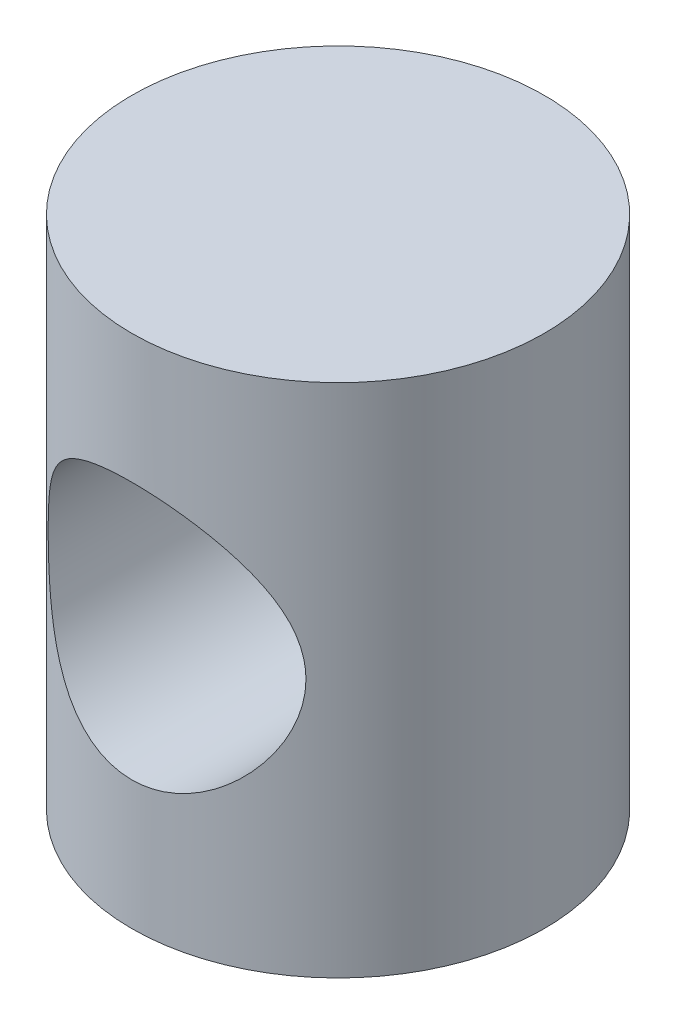
ISO-10303-21;
HEADER;
FILE_DESCRIPTION(('STEP AP214'),'2;1');
FILE_NAME('part.step','',(''),(''),'','','');
FILE_SCHEMA(('AUTOMOTIVE_DESIGN { 1 0 10303 214 1 1 1 1 }'));
ENDSEC;
DATA;
#1=APPLICATION_CONTEXT('core data for automotive mechanical design processes');
#2=APPLICATION_PROTOCOL_DEFINITION('international standard','automotive_design',2000,#1);
#3=PRODUCT_CONTEXT('',#1,'mechanical');
#4=PRODUCT('Part','Part','',(#3));
#5=PRODUCT_RELATED_PRODUCT_CATEGORY('part','',(#4));
#6=PRODUCT_DEFINITION_FORMATION('','',#4);
#7=PRODUCT_DEFINITION_CONTEXT('part definition',#1,'design');
#8=PRODUCT_DEFINITION('design','',#6,#7);
#9=PRODUCT_DEFINITION_SHAPE('','',#8);
#10=(LENGTH_UNIT() NAMED_UNIT(*) SI_UNIT(.MILLI.,.METRE.));
#11=(NAMED_UNIT(*) PLANE_ANGLE_UNIT() SI_UNIT($,.RADIAN.));
#12=(NAMED_UNIT(*) SI_UNIT($,.STERADIAN.) SOLID_ANGLE_UNIT());
#13=UNCERTAINTY_MEASURE_WITH_UNIT(LENGTH_MEASURE(1.E-05),#10,'distance_accuracy_value','');
#14=(GEOMETRIC_REPRESENTATION_CONTEXT(3) GLOBAL_UNCERTAINTY_ASSIGNED_CONTEXT((#13)) GLOBAL_UNIT_ASSIGNED_CONTEXT((#10,
#11,#12)) REPRESENTATION_CONTEXT('',''));
#15=CARTESIAN_POINT('',(0.,0.,0.));
#16=DIRECTION('',(0.,0.,1.));
#17=DIRECTION('',(1.,0.,0.));
#18=AXIS2_PLACEMENT_3D('',#15,#16,#17);
#19=CARTESIAN_POINT('',(0.,10.,0.));
#20=DIRECTION('',(0.,-1.,0.));
#21=DIRECTION('',(0.,0.,-1.));
#22=AXIS2_PLACEMENT_3D('',#19,#20,#21);
#23=CYLINDRICAL_SURFACE('',#22,4.);
#24=CARTESIAN_POINT('',(0.,7.5,-4.));
#25=CARTESIAN_POINT('',(-0.127017476559871,7.49998952385639,-3.99999041333571));
#26=CARTESIAN_POINT('',(-0.254191951791703,7.49025350009832,-3.9938860659399));
#27=CARTESIAN_POINT('',(-0.504637456621344,7.45182887031573,-3.97004375552586));
#28=CARTESIAN_POINT('',(-0.627900575825985,7.42310413973879,-3.95228361873137));
#29=CARTESIAN_POINT('',(-0.866410868269162,7.34837714671246,-3.90691695293563));
#30=CARTESIAN_POINT('',(-0.98169442070943,7.30246039021243,-3.87935918690877));
#31=CARTESIAN_POINT('',(-1.20252080434994,7.19522833250853,-3.81669199838277));
#32=CARTESIAN_POINT('',(-1.30806471304098,7.13391473744688,-3.7815834126609));
#33=CARTESIAN_POINT('',(-1.51594836437078,6.9922268434089,-3.70340304945466));
#34=CARTESIAN_POINT('',(-1.61735911616791,6.91072139729824,-3.65991924217889));
#35=CARTESIAN_POINT('',(-1.80597275567284,6.73356165374148,-3.57062700058922));
#36=CARTESIAN_POINT('',(-1.89315621594404,6.63788834426107,-3.52481549782957));
#37=CARTESIAN_POINT('',(-2.06285746302521,6.41993221070879,-3.42860837235627));
#38=CARTESIAN_POINT('',(-2.14314412018317,6.29580042656906,-3.37843221966147));
#39=CARTESIAN_POINT('',(-2.28147932079995,6.03287036932165,-3.28660396278105));
#40=CARTESIAN_POINT('',(-2.33956541787438,5.89409737483202,-3.2449375200046));
#41=CARTESIAN_POINT('',(-2.41866801180576,5.64237895245428,-3.18619151248815));
#42=CARTESIAN_POINT('',(-2.44539104794679,5.53206636308169,-3.16553811970886));
#43=CARTESIAN_POINT('',(-2.4836368711914,5.30738814861931,-3.1356271466086));
#44=CARTESIAN_POINT('',(-2.49518112485637,5.19302848282679,-3.12635347378456));
#45=CARTESIAN_POINT('',(-2.50237836690497,4.96317396712363,-3.12059771534501));
#46=CARTESIAN_POINT('',(-2.49798968200884,4.84767692942204,-3.12414917427958));
#47=CARTESIAN_POINT('',(-2.47352633347829,4.61937979127337,-3.14354804883411));
#48=CARTESIAN_POINT('',(-2.45343909745149,4.50658192715008,-3.15940531965489));
#49=CARTESIAN_POINT('',(-2.3993620946426,4.28912310325641,-3.20065145822146));
#50=CARTESIAN_POINT('',(-2.36570043522604,4.18433512028263,-3.22581428653571));
#51=CARTESIAN_POINT('',(-2.28580369589507,3.98167760352679,-3.28291134443418));
#52=CARTESIAN_POINT('',(-2.2395641689404,3.88381053215654,-3.31484796808522));
#53=CARTESIAN_POINT('',(-2.12589830407261,3.67833359248984,-3.38909625095658));
#54=CARTESIAN_POINT('',(-2.05612773657747,3.57231894814763,-3.4322315520855));
#55=CARTESIAN_POINT('',(-1.90176111958637,3.3723388730236,-3.52011451554715));
#56=CARTESIAN_POINT('',(-1.81714983251341,3.27838599995486,-3.56486379714022));
#57=CARTESIAN_POINT('',(-1.61904732877734,3.08939899041739,-3.65959667460596));
#58=CARTESIAN_POINT('',(-1.50309447420017,2.9967440572784,-3.70922571443728));
#59=CARTESIAN_POINT('',(-1.25426444468514,2.83228820636899,-3.8005660184067));
#60=CARTESIAN_POINT('',(-1.12139395127005,2.76047909219052,-3.84228039228673));
#61=CARTESIAN_POINT('',(-0.915775751567442,2.67265404336502,-3.89435975869902));
#62=CARTESIAN_POINT('',(-0.848193583187393,2.64716571356961,-3.90966874385268));
#63=CARTESIAN_POINT('',(-0.710492049478446,2.60199234952136,-3.93701839875445));
#64=CARTESIAN_POINT('',(-0.640374175967899,2.58230396342918,-3.94906095588034));
#65=CARTESIAN_POINT('',(-0.498239019538473,2.54906583835761,-3.96949699527849));
#66=CARTESIAN_POINT('',(-0.426223500915276,2.53551059647401,-3.97789374843884));
#67=CARTESIAN_POINT('',(-0.280965673560733,2.51475370668643,-3.99078766491331));
#68=CARTESIAN_POINT('',(-0.207723576570753,2.5075509734527,-3.99528549435853));
#69=CARTESIAN_POINT('',(-0.00911917689680724,2.49689069535646,-4.00193773474167));
#70=CARTESIAN_POINT('',(0.116782016705694,2.49959963687648,-4.000238122366));
#71=CARTESIAN_POINT('',(0.365967766011665,2.52375966446545,-3.98518313408306));
#72=CARTESIAN_POINT('',(0.489252499359948,2.54520947392473,-3.97182855210102));
#73=CARTESIAN_POINT('',(0.725036194002599,2.60447858798278,-3.93547975555369));
#74=CARTESIAN_POINT('',(0.83776842106291,2.64162472076979,-3.91288306371126));
#75=CARTESIAN_POINT('',(1.05527816125331,2.73059237131243,-3.85991402897874));
#76=CARTESIAN_POINT('',(1.16005433861599,2.78241634650143,-3.82954038411642));
#77=CARTESIAN_POINT('',(1.37016761969194,2.90503053750783,-3.75980014020658));
#78=CARTESIAN_POINT('',(1.47449380296905,2.97720717227503,-3.71983526755373));
#79=CARTESIAN_POINT('',(1.67028541330073,3.13558769646929,-3.63613942885727));
#80=CARTESIAN_POINT('',(1.76173634038025,3.22180716888569,-3.59240430473134));
#81=CARTESIAN_POINT('',(1.94294835276253,3.42027008984565,-3.49811738486729));
#82=CARTESIAN_POINT('',(2.03053702733637,3.53447441549752,-3.44749766579192));
#83=CARTESIAN_POINT('',(2.18560704916439,3.77775156698257,-3.35133525746893));
#84=CARTESIAN_POINT('',(2.25310231693768,3.90681401289131,-3.30578906708369));
#85=CARTESIAN_POINT('',(2.35369543821018,4.14938429659957,-3.23467060578839));
#86=CARTESIAN_POINT('',(2.39103791720685,4.26048150138871,-3.20691272363805));
#87=CARTESIAN_POINT('',(2.45000216420747,4.48878629161345,-3.16210061351252));
#88=CARTESIAN_POINT('',(2.47164849805251,4.60598401968943,-3.1450296652982));
#89=CARTESIAN_POINT('',(2.49802767469226,4.8441805529704,-3.124126499326));
#90=CARTESIAN_POINT('',(2.50266374586469,4.96519716787993,-3.12037003193165));
#91=CARTESIAN_POINT('',(2.49439556773531,5.20626192382951,-3.12698126375719));
#92=CARTESIAN_POINT('',(2.48148548821457,5.32630972961936,-3.13735365770479));
#93=CARTESIAN_POINT('',(2.44076547086104,5.55205957943611,-3.16910777009989));
#94=CARTESIAN_POINT('',(2.41423847191721,5.65813856450238,-3.18953614189074));
#95=CARTESIAN_POINT('',(2.34835238743426,5.86427015751826,-3.23835062785226));
#96=CARTESIAN_POINT('',(2.3089879509078,5.96432023181727,-3.26674005971309));
#97=CARTESIAN_POINT('',(2.21205415803959,6.17119332433813,-3.33327797617852));
#98=CARTESIAN_POINT('',(2.15267427981667,6.27689994626374,-3.3722442852408));
#99=CARTESIAN_POINT('',(2.01999894889208,6.47787738570926,-3.45335445323995));
#100=CARTESIAN_POINT('',(1.94669224594686,6.57313966737408,-3.49550086438999));
#101=CARTESIAN_POINT('',(1.77134669685941,6.77002558379843,-3.58803675426846));
#102=CARTESIAN_POINT('',(1.66649284489893,6.86916976153929,-3.63840488260278));
#103=CARTESIAN_POINT('',(1.43961937990848,7.04900159612506,-3.7339805383823));
#104=CARTESIAN_POINT('',(1.3175892119665,7.12967782367752,-3.77918486147258));
#105=CARTESIAN_POINT('',(1.12346357942551,7.23456343855875,-3.83959214728415));
#106=CARTESIAN_POINT('',(1.05679601158094,7.26687480004699,-3.85851834157057));
#107=CARTESIAN_POINT('',(0.920199584374062,7.32567225182379,-3.89335165397882));
#108=CARTESIAN_POINT('',(0.850272633931984,7.3521617011351,-3.9092605122592));
#109=CARTESIAN_POINT('',(0.707873688437766,7.39885714446216,-3.93753374175517));
#110=CARTESIAN_POINT('',(0.635409144572264,7.41908005724566,-3.94990764965183));
#111=CARTESIAN_POINT('',(0.488456989557115,7.45297545558237,-3.97075677458059));
#112=CARTESIAN_POINT('',(0.413970913545528,7.46665277243948,-3.97923486692924));
#113=CARTESIAN_POINT('',(0.28285260509405,7.48459041022673,-3.99038271291771));
#114=CARTESIAN_POINT('',(0.226501515914868,7.49036153025218,-3.99398159517595));
#115=CARTESIAN_POINT('',(0.113444074519046,7.49806878362715,-3.99879245372932));
#116=CARTESIAN_POINT('',(0.0567377005313052,7.50000467961036,-4.00000428228699));
#117=CARTESIAN_POINT('',(0.,7.5,-4.));
#118=B_SPLINE_CURVE_WITH_KNOTS('',3,(#24,#25,#26,#27,#28,#29,#30,#31,#32,#33,#34,#35,#36,#37,
#38,#39,#40,#41,#42,#43,#44,#45,#46,#47,#48,#49,#50,#51,#52,#53,#54,#55,#56,#57,#58,#59,#60,#61,
#62,#63,#64,#65,#66,#67,#68,#69,#70,#71,#72,#73,#74,#75,#76,#77,#78,#79,#80,#81,#82,#83,#84,#85,
#86,#87,#88,#89,#90,#91,#92,#93,#94,#95,#96,#97,#98,#99,#100,#101,#102,#103,#104,#105,#106,#107,
#108,#109,#110,#111,#112,#113,#114,#115,#116,#117),.UNSPECIFIED.,.T.,.F.,(4,2,2,2,2,2,2,2,2,2,2,
2,2,2,2,2,2,2,2,2,2,2,2,2,2,2,2,2,2,2,2,2,2,2,2,2,2,2,2,2,2,2,2,2,2,2,4),(0.,0.380824602868265,
0.762375788256924,1.14205397519027,1.52169010807759,1.93164374107244,2.34215256651403,
2.80825951705947,3.27357449214021,3.61824017759434,3.96241789414781,4.30749646997556,
4.65285169010166,4.99031678920873,5.32790135816065,5.72854900708719,6.12961045150363,
6.59684361399043,7.06389281455722,7.28510978359955,7.50619865744382,7.72708876613707,
7.94794112831293,8.32363778110177,8.69930884379593,9.06028425977628,9.42132014771964,
9.81879878896136,10.216721545704,10.6724083464246,11.1277787130885,11.4876929754247,
11.8470427174174,12.2084336629143,12.5699447204276,12.9023575499051,13.2349091154192,
13.6156046298899,13.9966089922257,14.4531049498525,14.9098826607203,15.138984863948,
15.3679545348469,15.5963005225022,15.8244777070605,15.994578512822,16.1646898459841),.UNSPECIFIED.);
#119=CARTESIAN_POINT('',(0.,7.5,-4.));
#120=VERTEX_POINT('',#119);
#121=EDGE_CURVE('E10',#120,#120,#118,.T.);
#122=ORIENTED_EDGE('',*,*,#121,.T.);
#123=EDGE_LOOP('',(#122));
#124=FACE_BOUND('',#123,.T.);
#125=CARTESIAN_POINT('',(2.5,5.,3.1224989991992));
#126=CARTESIAN_POINT('',(2.49999941097139,4.93784324855449,3.12249991555421));
#127=CARTESIAN_POINT('',(2.49767581942173,4.87567405332921,3.12436490733917));
#128=CARTESIAN_POINT('',(2.48843349840857,4.75188282045226,3.13172923119026));
#129=CARTESIAN_POINT('',(2.48151206248433,4.6902611267429,3.13723070381364));
#130=CARTESIAN_POINT('',(2.45397595058365,4.50677395225629,3.15888953558505));
#131=CARTESIAN_POINT('',(2.42658990946459,4.38645166881102,3.18020036271142));
#132=CARTESIAN_POINT('',(2.35576217141197,4.15440180212176,3.23299770760367));
#133=CARTESIAN_POINT('',(2.31245961359202,4.0426095849449,3.26439575383209));
#134=CARTESIAN_POINT('',(2.21143916430899,3.82799147466594,3.3336600088444));
#135=CARTESIAN_POINT('',(2.15372087963017,3.72516582624691,3.37152639405534));
#136=CARTESIAN_POINT('',(2.01647682425577,3.51626601869634,3.45559225121876));
#137=CARTESIAN_POINT('',(1.93506425666949,3.41160667499548,3.50222814511578));
#138=CARTESIAN_POINT('',(1.75662526657431,3.2162384483762,3.59505503533368));
#139=CARTESIAN_POINT('',(1.65958538899782,3.12554172004638,3.64124561158438));
#140=CARTESIAN_POINT('',(1.43833990582854,2.94977970182732,3.73459524771314));
#141=CARTESIAN_POINT('',(1.31226934259651,2.86671381554957,3.78119887781505));
#142=CARTESIAN_POINT('',(1.11163395543429,2.75945484526376,3.84307251838774));
#143=CARTESIAN_POINT('',(1.04281240974104,2.72658486166689,3.86236283092052));
#144=CARTESIAN_POINT('',(0.901758767615547,2.66704531463672,3.89770436975436));
#145=CARTESIAN_POINT('',(0.829529068393795,2.64037146896158,3.91375783207118));
#146=CARTESIAN_POINT('',(0.689700297916574,2.59601618474372,3.94066759113823));
#147=CARTESIAN_POINT('',(0.622371981278586,2.57769802348189,3.95188535984466));
#148=CARTESIAN_POINT('',(0.485997575898806,2.54669771368665,3.97096241909162));
#149=CARTESIAN_POINT('',(0.416952503441681,2.53401231078379,3.97882364879721));
#150=CARTESIAN_POINT('',(0.277765449857172,2.51448620236546,3.99095470334737));
#151=CARTESIAN_POINT('',(0.207624174243904,2.50764188348659,3.99522674847834));
#152=CARTESIAN_POINT('',(0.0669114466599378,2.49990078661078,4.00006125072437));
#153=CARTESIAN_POINT('',(-0.00365995486027998,2.49900332403665,4.00062413482248));
#154=CARTESIAN_POINT('',(-0.196045081555539,2.50472537354725,3.99704479619503));
#155=CARTESIAN_POINT('',(-0.317681845488537,2.51730650307888,3.98917040897436));
#156=CARTESIAN_POINT('',(-0.556636494620256,2.55973021796612,3.96290903275931));
#157=CARTESIAN_POINT('',(-0.673954052677426,2.58957410797362,3.94452124920477));
#158=CARTESIAN_POINT('',(-0.901771991763867,2.66520855928326,3.89876170711609));
#159=CARTESIAN_POINT('',(-1.01225407159606,2.71103991957107,3.87136697381047));
#160=CARTESIAN_POINT('',(-1.22404012071223,2.81693723898429,3.80971291751354));
#161=CARTESIAN_POINT('',(-1.32534199174245,2.87700644106365,3.77545203089318));
#162=CARTESIAN_POINT('',(-1.52942649744659,3.01805641692367,3.69786441247167));
#163=CARTESIAN_POINT('',(-1.63082454612907,3.10070927669048,3.65394006381521));
#164=CARTESIAN_POINT('',(-1.81919733573062,3.28026473720707,3.56390927740507));
#165=CARTESIAN_POINT('',(-1.90615071842624,3.37718804638397,3.51779973570409));
#166=CARTESIAN_POINT('',(-2.07470887167909,3.59741125317348,3.42142883464466));
#167=CARTESIAN_POINT('',(-2.15413229677844,3.72250276335808,3.37141162686597));
#168=CARTESIAN_POINT('',(-2.29052307550563,3.98729223730141,3.28028278192382));
#169=CARTESIAN_POINT('',(-2.34753179448504,4.12696268745311,3.23915480386931));
#170=CARTESIAN_POINT('',(-2.42437133527931,4.37953880610625,3.18183753131763));
#171=CARTESIAN_POINT('',(-2.45003683445404,4.48982192521349,3.16193408602513));
#172=CARTESIAN_POINT('',(-2.48620337073091,4.71423037755989,3.13358277759547));
#173=CARTESIAN_POINT('',(-2.49672512520811,4.82835024265681,3.12511926504439));
#174=CARTESIAN_POINT('',(-2.5019707209518,5.05745736050245,3.12092267030677));
#175=CARTESIAN_POINT('',(-2.49665835896695,5.17244600047846,3.12521876170185));
#176=CARTESIAN_POINT('',(-2.47051466367814,5.39956116431848,3.14592085836188));
#177=CARTESIAN_POINT('',(-2.44967047849126,5.51168523837118,3.16233689222906));
#178=CARTESIAN_POINT('',(-2.39409874195038,5.72843675942569,3.20460120797143));
#179=CARTESIAN_POINT('',(-2.35960571424757,5.83315731589433,3.23028954367817));
#180=CARTESIAN_POINT('',(-2.27804893702243,6.03557469989379,3.28831148388749));
#181=CARTESIAN_POINT('',(-2.23098072583746,6.13326901887797,3.32064744602081));
#182=CARTESIAN_POINT('',(-2.11530798730694,6.3386119416632,3.39574401285203));
#183=CARTESIAN_POINT('',(-2.04430931160543,6.44461452730177,3.43931724293016));
#184=CARTESIAN_POINT('',(-1.88737868921489,6.64437066065427,3.52787943213338));
#185=CARTESIAN_POINT('',(-1.80143124902619,6.73811132124234,3.57286982004467));
#186=CARTESIAN_POINT('',(-1.6007693249212,6.92596407064096,3.66766209459505));
#187=CARTESIAN_POINT('',(-1.48365201617176,7.01772739848491,3.71707933883201));
#188=CARTESIAN_POINT('',(-1.23256787407809,7.18014701471972,3.80768973398606));
#189=CARTESIAN_POINT('',(-1.09860897940973,7.25081319512692,3.84888673619009));
#190=CARTESIAN_POINT('',(-0.891930804655074,7.33658106797499,3.89988966499776));
#191=CARTESIAN_POINT('',(-0.824318196039413,7.36129744395128,3.91477055097245));
#192=CARTESIAN_POINT('',(-0.686640792876416,7.40493827673228,3.94124643918619));
#193=CARTESIAN_POINT('',(-0.616577444051128,7.42386608615092,3.95284334314805));
#194=CARTESIAN_POINT('',(-0.474639231464256,7.45560583013925,3.9723851203995));
#195=CARTESIAN_POINT('',(-0.4027660057555,7.46842309951643,3.98033317908836));
#196=CARTESIAN_POINT('',(-0.257881807142454,7.48773917229289,3.99234168343343));
#197=CARTESIAN_POINT('',(-0.184871024482528,7.49423902093079,3.99640277220024));
#198=CARTESIAN_POINT('',(0.0131102774248997,7.50307151550711,4.00191521492706));
#199=CARTESIAN_POINT('',(0.138539079205457,7.49926579290941,3.99952706123947));
#200=CARTESIAN_POINT('',(0.386583137102138,7.47308241045447,3.98321975018362));
#201=CARTESIAN_POINT('',(0.509198520626837,7.45070559332119,3.96930111604857));
#202=CARTESIAN_POINT('',(0.744080605483855,7.38967758445388,3.93192083384285));
#203=CARTESIAN_POINT('',(0.856558752631817,7.35161792643532,3.90880701054803));
#204=CARTESIAN_POINT('',(1.07343034721918,7.26088053755652,3.85489971248843));
#205=CARTESIAN_POINT('',(1.17782242685803,7.20820034043279,3.82410494215308));
#206=CARTESIAN_POINT('',(1.38731297754798,7.08367872128004,3.75350673935648));
#207=CARTESIAN_POINT('',(1.4913601218378,7.0104160092425,3.71310001864657));
#208=CARTESIAN_POINT('',(1.68643334934803,6.84984676748589,3.62867283985205));
#209=CARTESIAN_POINT('',(1.77744451843681,6.76252439116571,3.58464833191203));
#210=CARTESIAN_POINT('',(1.95744716561589,6.56176748493812,3.49000828219718));
#211=CARTESIAN_POINT('',(2.04425661250064,6.44638338742857,3.43935738427104));
#212=CARTESIAN_POINT('',(2.19754648509905,6.20071059024024,3.34349647457112));
#213=CARTESIAN_POINT('',(2.26403815415028,6.07043018884747,3.2982834620419));
#214=CARTESIAN_POINT('',(2.3619822941284,5.82719469921508,3.22859539780091));
#215=CARTESIAN_POINT('',(2.39792458576829,5.71672942784644,3.20174639338769));
#216=CARTESIAN_POINT('',(2.45425618419746,5.49006065699822,3.1587835810451));
#217=CARTESIAN_POINT('',(2.47469472410168,5.37387658020028,3.14263581150428));
#218=CARTESIAN_POINT('',(2.49119847139522,5.21394000535392,3.12952857640607));
#219=CARTESIAN_POINT('',(2.49449433837959,5.17127447429134,3.1268999430677));
#220=CARTESIAN_POINT('',(2.49889558125807,5.08574130104825,3.12338461939862));
#221=CARTESIAN_POINT('',(2.50000040629188,5.04287361075664,3.12249836712871));
#222=CARTESIAN_POINT('',(2.5,5.,3.1224989991992));
#223=B_SPLINE_CURVE_WITH_KNOTS('',3,(#125,#126,#127,#128,#129,#130,#131,#132,#133,#134,#135,
#136,#137,#138,#139,#140,#141,#142,#143,#144,#145,#146,#147,#148,#149,#150,#151,#152,#153,#154,
#155,#156,#157,#158,#159,#160,#161,#162,#163,#164,#165,#166,#167,#168,#169,#170,#171,#172,#173,
#174,#175,#176,#177,#178,#179,#180,#181,#182,#183,#184,#185,#186,#187,#188,#189,#190,#191,#192,
#193,#194,#195,#196,#197,#198,#199,#200,#201,#202,#203,#204,#205,#206,#207,#208,#209,#210,#211,
#212,#213,#214,#215,#216,#217,#218,#219,#220,#221,#222),.UNSPECIFIED.,.T.,.F.,(4,2,2,2,2,2,2,2,
2,2,2,2,2,2,2,2,2,2,2,2,2,2,2,2,2,2,2,2,2,2,2,2,2,2,2,2,2,2,2,2,2,2,2,2,2,2,2,2,4),(0.,
0.186415315858462,0.372940459994497,0.746478880764687,1.11682668423133,1.48718459072605,
1.90722798685071,2.32763499192879,2.7987602926597,3.03445880867314,3.26999394209509,
3.48170145743205,3.69328649746504,3.90474055342595,4.11617026725867,4.48184709708114,
4.84755156693919,5.21419620193004,5.58092442797434,5.99329080205307,6.40626158573464,
6.87316206383505,7.33919680735486,7.68265621505466,8.02564530559509,8.36941921026407,
8.7134778886509,9.05186495232125,9.390372235192,9.79332737765188,10.1967026751544,
10.6647326786671,11.1325428866818,11.3527929661039,11.5729152387446,11.7928449800804,
12.0127383271002,12.3871595324234,12.7615637480926,13.1229788842094,13.4844550226785,
13.8834503840958,14.2828986410983,14.7399238503459,15.1966956936287,15.5530255473292,
15.9082190611886,16.0367696833384,16.1653526209168),.UNSPECIFIED.);
#224=CARTESIAN_POINT('',(2.5,5.,3.1224989991992));
#225=VERTEX_POINT('',#224);
#226=EDGE_CURVE('E51',#225,#225,#223,.T.);
#227=ORIENTED_EDGE('',*,*,#226,.T.);
#228=EDGE_LOOP('',(#227));
#229=FACE_BOUND('',#228,.T.);
#230=CARTESIAN_POINT('',(0.,10.,0.));
#231=DIRECTION('',(0.,1.,0.));
#232=DIRECTION('',(0.,0.,1.));
#233=AXIS2_PLACEMENT_3D('',#230,#231,#232);
#234=CIRCLE('',#233,4.);
#235=CARTESIAN_POINT('',(0.,10.,4.));
#236=VERTEX_POINT('',#235);
#237=EDGE_CURVE('E55',#236,#236,#234,.T.);
#238=ORIENTED_EDGE('',*,*,#237,.F.);
#239=EDGE_LOOP('',(#238));
#240=FACE_BOUND('',#239,.T.);
#241=CARTESIAN_POINT('',(0.,0.,0.));
#242=DIRECTION('',(0.,1.,0.));
#243=DIRECTION('',(0.,0.,1.));
#244=AXIS2_PLACEMENT_3D('',#241,#242,#243);
#245=CIRCLE('',#244,4.);
#246=CARTESIAN_POINT('',(0.,0.,4.));
#247=VERTEX_POINT('',#246);
#248=EDGE_CURVE('E59',#247,#247,#245,.T.);
#249=ORIENTED_EDGE('',*,*,#248,.T.);
#250=EDGE_LOOP('',(#249));
#251=FACE_BOUND('',#250,.T.);
#252=ADVANCED_FACE('F40',(#124,#229,#240,#251),#23,.T.);
#253=CARTESIAN_POINT('',(0.,10.,0.));
#254=DIRECTION('',(0.,1.,0.));
#255=DIRECTION('',(0.,0.,1.));
#256=AXIS2_PLACEMENT_3D('',#253,#254,#255);
#257=PLANE('',#256);
#258=ORIENTED_EDGE('',*,*,#237,.T.);
#259=EDGE_LOOP('',(#258));
#260=FACE_BOUND('',#259,.T.);
#261=ADVANCED_FACE('F71',(#260),#257,.T.);
#262=CARTESIAN_POINT('',(0.,0.,0.));
#263=DIRECTION('',(0.,1.,0.));
#264=DIRECTION('',(0.,0.,1.));
#265=AXIS2_PLACEMENT_3D('',#262,#263,#264);
#266=PLANE('',#265);
#267=ORIENTED_EDGE('',*,*,#248,.F.);
#268=EDGE_LOOP('',(#267));
#269=FACE_BOUND('',#268,.T.);
#270=ADVANCED_FACE('F69',(#269),#266,.F.);
#271=CARTESIAN_POINT('',(0.,5.,4.));
#272=DIRECTION('',(0.,0.,1.));
#273=DIRECTION('',(1.,0.,0.));
#274=AXIS2_PLACEMENT_3D('',#271,#272,#273);
#275=CYLINDRICAL_SURFACE('',#274,2.5);
#276=ORIENTED_EDGE('',*,*,#226,.F.);
#277=EDGE_LOOP('',(#276));
#278=FACE_BOUND('',#277,.T.);
#279=ORIENTED_EDGE('',*,*,#121,.F.);
#280=EDGE_LOOP('',(#279));
#281=FACE_BOUND('',#280,.T.);
#282=ADVANCED_FACE('F65',(#278,#281),#275,.F.);
#283=CLOSED_SHELL('',(#252,#261,#270,#282));
#284=MANIFOLD_SOLID_BREP('B2',#283);
#285=ADVANCED_BREP_SHAPE_REPRESENTATION('',(#18,#284),#14);
#286=SHAPE_DEFINITION_REPRESENTATION(#9,#285);
ENDSEC;
END-ISO-10303-21;
